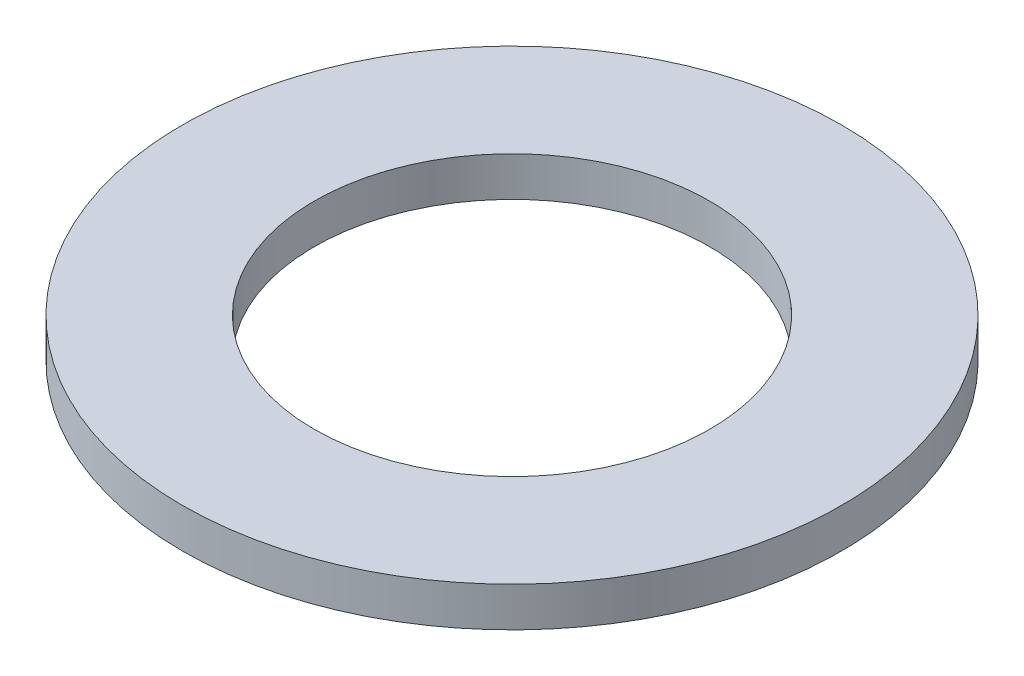
ISO-10303-21;
HEADER;
FILE_DESCRIPTION(('STEP AP214'),'2;1');
FILE_NAME('part.step','',(''),(''),'','','');
FILE_SCHEMA(('AUTOMOTIVE_DESIGN { 1 0 10303 214 1 1 1 1 }'));
ENDSEC;
DATA;
#1=APPLICATION_CONTEXT('core data for automotive mechanical design processes');
#2=APPLICATION_PROTOCOL_DEFINITION('international standard','automotive_design',2000,#1);
#3=PRODUCT_CONTEXT('',#1,'mechanical');
#4=PRODUCT('Part','Part','',(#3));
#5=PRODUCT_RELATED_PRODUCT_CATEGORY('part','',(#4));
#6=PRODUCT_DEFINITION_FORMATION('','',#4);
#7=PRODUCT_DEFINITION_CONTEXT('part definition',#1,'design');
#8=PRODUCT_DEFINITION('design','',#6,#7);
#9=PRODUCT_DEFINITION_SHAPE('','',#8);
#10=(LENGTH_UNIT() NAMED_UNIT(*) SI_UNIT(.MILLI.,.METRE.));
#11=(NAMED_UNIT(*) PLANE_ANGLE_UNIT() SI_UNIT($,.RADIAN.));
#12=(NAMED_UNIT(*) SI_UNIT($,.STERADIAN.) SOLID_ANGLE_UNIT());
#13=UNCERTAINTY_MEASURE_WITH_UNIT(LENGTH_MEASURE(1.E-05),#10,'distance_accuracy_value','');
#14=(GEOMETRIC_REPRESENTATION_CONTEXT(3) GLOBAL_UNCERTAINTY_ASSIGNED_CONTEXT((#13)) GLOBAL_UNIT_ASSIGNED_CONTEXT((#10,
#11,#12)) REPRESENTATION_CONTEXT('',''));
#15=CARTESIAN_POINT('',(0.,0.,0.));
#16=DIRECTION('',(0.,0.,1.));
#17=DIRECTION('',(1.,0.,0.));
#18=AXIS2_PLACEMENT_3D('',#15,#16,#17);
#19=CARTESIAN_POINT('',(0.,0.3,0.));
#20=DIRECTION('',(0.,1.,0.));
#21=DIRECTION('',(0.,0.,1.));
#22=AXIS2_PLACEMENT_3D('',#19,#20,#21);
#23=PLANE('',#22);
#24=CARTESIAN_POINT('',(0.,0.3,0.));
#25=DIRECTION('',(0.,1.,0.));
#26=DIRECTION('',(0.,0.,1.));
#27=AXIS2_PLACEMENT_3D('',#24,#25,#26);
#28=CIRCLE('',#27,2.5);
#29=CARTESIAN_POINT('',(0.,0.3,2.5));
#30=VERTEX_POINT('',#29);
#31=EDGE_CURVE('E10',#30,#30,#28,.T.);
#32=ORIENTED_EDGE('',*,*,#31,.T.);
#33=EDGE_LOOP('',(#32));
#34=FACE_BOUND('',#33,.T.);
#35=CARTESIAN_POINT('',(0.,0.3,0.));
#36=DIRECTION('',(0.,1.,0.));
#37=DIRECTION('',(0.,0.,1.));
#38=AXIS2_PLACEMENT_3D('',#35,#36,#37);
#39=CIRCLE('',#38,1.5);
#40=CARTESIAN_POINT('',(0.,0.3,1.5));
#41=VERTEX_POINT('',#40);
#42=EDGE_CURVE('E56',#41,#41,#39,.T.);
#43=ORIENTED_EDGE('',*,*,#42,.F.);
#44=EDGE_LOOP('',(#43));
#45=FACE_BOUND('',#44,.T.);
#46=ADVANCED_FACE('F43',(#34,#45),#23,.T.);
#47=CARTESIAN_POINT('',(0.,0.,0.));
#48=DIRECTION('',(0.,1.,0.));
#49=DIRECTION('',(0.,0.,1.));
#50=AXIS2_PLACEMENT_3D('',#47,#48,#49);
#51=PLANE('',#50);
#52=CARTESIAN_POINT('',(0.,0.,0.));
#53=DIRECTION('',(0.,1.,0.));
#54=DIRECTION('',(0.,0.,1.));
#55=AXIS2_PLACEMENT_3D('',#52,#53,#54);
#56=CIRCLE('',#55,2.5);
#57=CARTESIAN_POINT('',(0.,0.,2.5));
#58=VERTEX_POINT('',#57);
#59=EDGE_CURVE('E47',#58,#58,#56,.T.);
#60=ORIENTED_EDGE('',*,*,#59,.F.);
#61=EDGE_LOOP('',(#60));
#62=FACE_BOUND('',#61,.T.);
#63=CARTESIAN_POINT('',(0.,0.,0.));
#64=DIRECTION('',(0.,1.,0.));
#65=DIRECTION('',(0.,0.,1.));
#66=AXIS2_PLACEMENT_3D('',#63,#64,#65);
#67=CIRCLE('',#66,1.5);
#68=CARTESIAN_POINT('',(0.,0.,1.5));
#69=VERTEX_POINT('',#68);
#70=EDGE_CURVE('E58',#69,#69,#67,.T.);
#71=ORIENTED_EDGE('',*,*,#70,.T.);
#72=EDGE_LOOP('',(#71));
#73=FACE_BOUND('',#72,.T.);
#74=ADVANCED_FACE('F70',(#62,#73),#51,.F.);
#75=CARTESIAN_POINT('',(0.,0.3,0.));
#76=DIRECTION('',(0.,-1.,0.));
#77=DIRECTION('',(0.,0.,-1.));
#78=AXIS2_PLACEMENT_3D('',#75,#76,#77);
#79=CYLINDRICAL_SURFACE('',#78,2.5);
#80=ORIENTED_EDGE('',*,*,#31,.F.);
#81=EDGE_LOOP('',(#80));
#82=FACE_BOUND('',#81,.T.);
#83=ORIENTED_EDGE('',*,*,#59,.T.);
#84=EDGE_LOOP('',(#83));
#85=FACE_BOUND('',#84,.T.);
#86=ADVANCED_FACE('F45',(#82,#85),#79,.T.);
#87=CARTESIAN_POINT('',(0.,0.3,0.));
#88=DIRECTION('',(0.,-1.,0.));
#89=DIRECTION('',(0.,0.,-1.));
#90=AXIS2_PLACEMENT_3D('',#87,#88,#89);
#91=CYLINDRICAL_SURFACE('',#90,1.5);
#92=ORIENTED_EDGE('',*,*,#42,.T.);
#93=EDGE_LOOP('',(#92));
#94=FACE_BOUND('',#93,.T.);
#95=ORIENTED_EDGE('',*,*,#70,.F.);
#96=EDGE_LOOP('',(#95));
#97=FACE_BOUND('',#96,.T.);
#98=ADVANCED_FACE('F66',(#94,#97),#91,.F.);
#99=CLOSED_SHELL('',(#46,#74,#86,#98));
#100=MANIFOLD_SOLID_BREP('B2',#99);
#101=ADVANCED_BREP_SHAPE_REPRESENTATION('',(#18,#100),#14);
#102=SHAPE_DEFINITION_REPRESENTATION(#9,#101);
ENDSEC;
END-ISO-10303-21;
